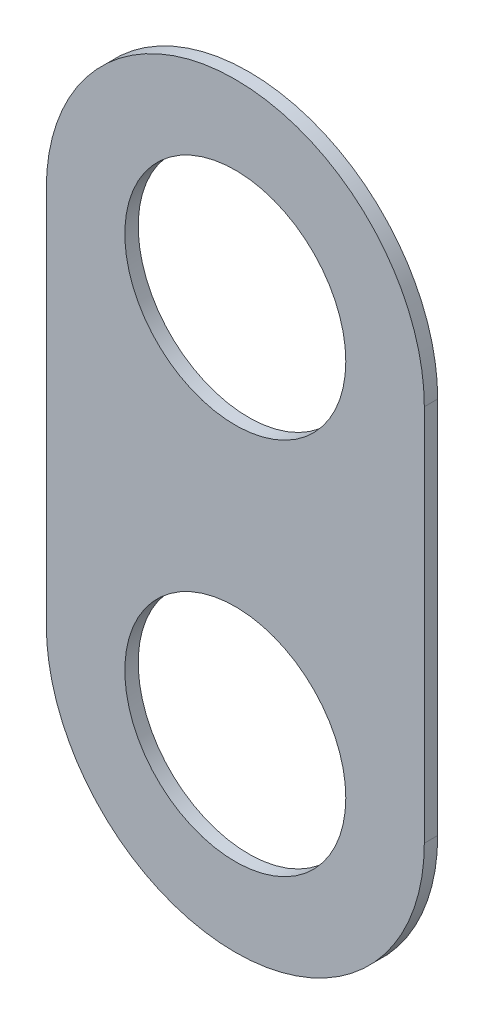
ISO-10303-21;
HEADER;
FILE_DESCRIPTION(('STEP AP214'),'2;1');
FILE_NAME('part.step','',(''),(''),'','','');
FILE_SCHEMA(('AUTOMOTIVE_DESIGN { 1 0 10303 214 1 1 1 1 }'));
ENDSEC;
DATA;
#1=APPLICATION_CONTEXT('core data for automotive mechanical design processes');
#2=APPLICATION_PROTOCOL_DEFINITION('international standard','automotive_design',2000,#1);
#3=PRODUCT_CONTEXT('',#1,'mechanical');
#4=PRODUCT('Part','Part','',(#3));
#5=PRODUCT_RELATED_PRODUCT_CATEGORY('part','',(#4));
#6=PRODUCT_DEFINITION_FORMATION('','',#4);
#7=PRODUCT_DEFINITION_CONTEXT('part definition',#1,'design');
#8=PRODUCT_DEFINITION('design','',#6,#7);
#9=PRODUCT_DEFINITION_SHAPE('','',#8);
#10=(LENGTH_UNIT() NAMED_UNIT(*) SI_UNIT(.MILLI.,.METRE.));
#11=(NAMED_UNIT(*) PLANE_ANGLE_UNIT() SI_UNIT($,.RADIAN.));
#12=(NAMED_UNIT(*) SI_UNIT($,.STERADIAN.) SOLID_ANGLE_UNIT());
#13=UNCERTAINTY_MEASURE_WITH_UNIT(LENGTH_MEASURE(1.E-05),#10,'distance_accuracy_value','');
#14=(GEOMETRIC_REPRESENTATION_CONTEXT(3) GLOBAL_UNCERTAINTY_ASSIGNED_CONTEXT((#13)) GLOBAL_UNIT_ASSIGNED_CONTEXT((#10,
#11,#12)) REPRESENTATION_CONTEXT('',''));
#15=CARTESIAN_POINT('',(0.,0.,0.));
#16=DIRECTION('',(0.,0.,1.));
#17=DIRECTION('',(1.,0.,0.));
#18=AXIS2_PLACEMENT_3D('',#15,#16,#17);
#19=CARTESIAN_POINT('',(19.05,24.7986501429514,1.34885860094992));
#20=DIRECTION('',(0.,0.,1.));
#21=DIRECTION('',(1.,0.,0.));
#22=AXIS2_PLACEMENT_3D('',#19,#20,#21);
#23=PLANE('',#22);
#24=CARTESIAN_POINT('',(19.05,24.7986501429514,1.34885860094992));
#25=DIRECTION('',(0.,0.,1.));
#26=DIRECTION('',(1.,0.,0.));
#27=AXIS2_PLACEMENT_3D('',#24,#25,#26);
#28=CIRCLE('',#27,11.13536);
#29=CARTESIAN_POINT('',(30.18536,24.7986501429514,1.34885860094992));
#30=VERTEX_POINT('',#29);
#31=EDGE_CURVE('E106',#30,#30,#28,.T.);
#32=ORIENTED_EDGE('',*,*,#31,.F.);
#33=EDGE_LOOP('',(#32));
#34=FACE_BOUND('',#33,.T.);
#35=CARTESIAN_POINT('',(19.05,24.7986501429514,1.34885860094992));
#36=DIRECTION('',(0.,0.,1.));
#37=DIRECTION('',(1.,0.,0.));
#38=AXIS2_PLACEMENT_3D('',#35,#36,#37);
#39=CIRCLE('',#38,19.05);
#40=CARTESIAN_POINT('',(38.1,24.7986501429514,1.34885860094992));
#41=VERTEX_POINT('',#40);
#42=CARTESIAN_POINT('',(0.,24.7986501429514,1.34885860094992));
#43=VERTEX_POINT('',#42);
#44=EDGE_CURVE('E91',#41,#43,#39,.T.);
#45=ORIENTED_EDGE('',*,*,#44,.T.);
#46=DIRECTION('',(0.,-1.,0.));
#47=VECTOR('',#46,1.);
#48=CARTESIAN_POINT('',(0.,24.7986501429514,1.34885860094992));
#49=LINE('',#48,#47);
#50=CARTESIAN_POINT('',(0.,-13.3013498570486,1.34885860094992));
#51=VERTEX_POINT('',#50);
#52=EDGE_CURVE('E86',#43,#51,#49,.T.);
#53=ORIENTED_EDGE('',*,*,#52,.T.);
#54=CARTESIAN_POINT('',(19.05,-13.3013498570486,1.34885860094992));
#55=DIRECTION('',(0.,0.,1.));
#56=DIRECTION('',(1.,0.,0.));
#57=AXIS2_PLACEMENT_3D('',#54,#55,#56);
#58=CIRCLE('',#57,19.05);
#59=CARTESIAN_POINT('',(38.1,-13.3013498570486,1.34885860094992));
#60=VERTEX_POINT('',#59);
#61=EDGE_CURVE('E87',#51,#60,#58,.T.);
#62=ORIENTED_EDGE('',*,*,#61,.T.);
#63=DIRECTION('',(0.,1.,0.));
#64=VECTOR('',#63,1.);
#65=CARTESIAN_POINT('',(38.1,24.7986501429514,1.34885860094992));
#66=LINE('',#65,#64);
#67=EDGE_CURVE('E57',#60,#41,#66,.T.);
#68=ORIENTED_EDGE('',*,*,#67,.T.);
#69=EDGE_LOOP('',(#45,#53,#62,#68));
#70=FACE_BOUND('',#69,.T.);
#71=CARTESIAN_POINT('',(19.05,-13.3013498570486,1.34885860094992));
#72=DIRECTION('',(0.,0.,1.));
#73=DIRECTION('',(1.,0.,0.));
#74=AXIS2_PLACEMENT_3D('',#71,#72,#73);
#75=CIRCLE('',#74,11.13536);
#76=CARTESIAN_POINT('',(30.18536,-13.3013498570486,1.34885860094992));
#77=VERTEX_POINT('',#76);
#78=EDGE_CURVE('E123',#77,#77,#75,.T.);
#79=ORIENTED_EDGE('',*,*,#78,.F.);
#80=EDGE_LOOP('',(#79));
#81=FACE_BOUND('',#80,.T.);
#82=ADVANCED_FACE('F39',(#34,#70,#81),#23,.T.);
#83=CARTESIAN_POINT('',(19.05,24.7986501429514,0.));
#84=DIRECTION('',(0.,0.,1.));
#85=DIRECTION('',(1.,0.,0.));
#86=AXIS2_PLACEMENT_3D('',#83,#84,#85);
#87=PLANE('',#86);
#88=CARTESIAN_POINT('',(19.05,24.7986501429514,0.));
#89=DIRECTION('',(0.,0.,1.));
#90=DIRECTION('',(1.,0.,0.));
#91=AXIS2_PLACEMENT_3D('',#88,#89,#90);
#92=CIRCLE('',#91,19.05);
#93=CARTESIAN_POINT('',(38.1,24.7986501429514,0.));
#94=VERTEX_POINT('',#93);
#95=CARTESIAN_POINT('',(0.,24.7986501429514,0.));
#96=VERTEX_POINT('',#95);
#97=EDGE_CURVE('E104',#94,#96,#92,.T.);
#98=ORIENTED_EDGE('',*,*,#97,.F.);
#99=DIRECTION('',(0.,1.,0.));
#100=VECTOR('',#99,1.);
#101=CARTESIAN_POINT('',(38.1,24.7986501429514,0.));
#102=LINE('',#101,#100);
#103=CARTESIAN_POINT('',(38.1,-13.3013498570486,0.));
#104=VERTEX_POINT('',#103);
#105=EDGE_CURVE('E80',#104,#94,#102,.T.);
#106=ORIENTED_EDGE('',*,*,#105,.F.);
#107=CARTESIAN_POINT('',(19.05,-13.3013498570486,0.));
#108=DIRECTION('',(0.,0.,1.));
#109=DIRECTION('',(1.,0.,0.));
#110=AXIS2_PLACEMENT_3D('',#107,#108,#109);
#111=CIRCLE('',#110,19.05);
#112=CARTESIAN_POINT('',(0.,-13.3013498570486,0.));
#113=VERTEX_POINT('',#112);
#114=EDGE_CURVE('E74',#113,#104,#111,.T.);
#115=ORIENTED_EDGE('',*,*,#114,.F.);
#116=DIRECTION('',(0.,-1.,0.));
#117=VECTOR('',#116,1.);
#118=CARTESIAN_POINT('',(0.,24.7986501429514,0.));
#119=LINE('',#118,#117);
#120=EDGE_CURVE('E94',#96,#113,#119,.T.);
#121=ORIENTED_EDGE('',*,*,#120,.F.);
#122=EDGE_LOOP('',(#98,#106,#115,#121));
#123=FACE_BOUND('',#122,.T.);
#124=CARTESIAN_POINT('',(19.05,24.7986501429514,0.));
#125=DIRECTION('',(0.,0.,1.));
#126=DIRECTION('',(1.,0.,0.));
#127=AXIS2_PLACEMENT_3D('',#124,#125,#126);
#128=CIRCLE('',#127,11.13536);
#129=CARTESIAN_POINT('',(30.18536,24.7986501429514,0.));
#130=VERTEX_POINT('',#129);
#131=EDGE_CURVE('E119',#130,#130,#128,.T.);
#132=ORIENTED_EDGE('',*,*,#131,.T.);
#133=EDGE_LOOP('',(#132));
#134=FACE_BOUND('',#133,.T.);
#135=CARTESIAN_POINT('',(19.05,-13.3013498570486,0.));
#136=DIRECTION('',(0.,0.,1.));
#137=DIRECTION('',(1.,0.,0.));
#138=AXIS2_PLACEMENT_3D('',#135,#136,#137);
#139=CIRCLE('',#138,11.13536);
#140=CARTESIAN_POINT('',(30.18536,-13.3013498570486,0.));
#141=VERTEX_POINT('',#140);
#142=EDGE_CURVE('E125',#141,#141,#139,.T.);
#143=ORIENTED_EDGE('',*,*,#142,.T.);
#144=EDGE_LOOP('',(#143));
#145=FACE_BOUND('',#144,.T.);
#146=ADVANCED_FACE('F114',(#123,#134,#145),#87,.F.);
#147=CARTESIAN_POINT('',(19.05,24.7986501429514,1.34885860094992));
#148=DIRECTION('',(0.,0.,-1.));
#149=DIRECTION('',(-1.,0.,0.));
#150=AXIS2_PLACEMENT_3D('',#147,#148,#149);
#151=CYLINDRICAL_SURFACE('',#150,19.05);
#152=ORIENTED_EDGE('',*,*,#97,.T.);
#153=DIRECTION('',(0.,0.,-1.));
#154=VECTOR('',#153,1.);
#155=CARTESIAN_POINT('',(0.,24.7986501429514,1.34885860094992));
#156=LINE('',#155,#154);
#157=EDGE_CURVE('E11',#43,#96,#156,.T.);
#158=ORIENTED_EDGE('',*,*,#157,.F.);
#159=ORIENTED_EDGE('',*,*,#44,.F.);
#160=DIRECTION('',(0.,0.,-1.));
#161=VECTOR('',#160,1.);
#162=CARTESIAN_POINT('',(38.1,24.7986501429514,1.34885860094992));
#163=LINE('',#162,#161);
#164=EDGE_CURVE('E98',#41,#94,#163,.T.);
#165=ORIENTED_EDGE('',*,*,#164,.T.);
#166=EDGE_LOOP('',(#152,#158,#159,#165));
#167=FACE_BOUND('',#166,.T.);
#168=ADVANCED_FACE('F41',(#167),#151,.T.);
#169=CARTESIAN_POINT('',(0.,24.7986501429514,1.34885860094992));
#170=DIRECTION('',(1.,0.,0.));
#171=DIRECTION('',(0.,1.,0.));
#172=AXIS2_PLACEMENT_3D('',#169,#170,#171);
#173=PLANE('',#172);
#174=ORIENTED_EDGE('',*,*,#120,.T.);
#175=DIRECTION('',(0.,0.,-1.));
#176=VECTOR('',#175,1.);
#177=CARTESIAN_POINT('',(0.,-13.3013498570486,1.34885860094992));
#178=LINE('',#177,#176);
#179=EDGE_CURVE('E48',#51,#113,#178,.T.);
#180=ORIENTED_EDGE('',*,*,#179,.F.);
#181=ORIENTED_EDGE('',*,*,#52,.F.);
#182=ORIENTED_EDGE('',*,*,#157,.T.);
#183=EDGE_LOOP('',(#174,#180,#181,#182));
#184=FACE_BOUND('',#183,.T.);
#185=ADVANCED_FACE('F92',(#184),#173,.F.);
#186=CARTESIAN_POINT('',(19.05,-13.3013498570486,1.34885860094992));
#187=DIRECTION('',(0.,0.,-1.));
#188=DIRECTION('',(-1.,0.,0.));
#189=AXIS2_PLACEMENT_3D('',#186,#187,#188);
#190=CYLINDRICAL_SURFACE('',#189,19.05);
#191=ORIENTED_EDGE('',*,*,#114,.T.);
#192=DIRECTION('',(0.,0.,-1.));
#193=VECTOR('',#192,1.);
#194=CARTESIAN_POINT('',(38.1,-13.3013498570486,1.34885860094992));
#195=LINE('',#194,#193);
#196=EDGE_CURVE('E96',#60,#104,#195,.T.);
#197=ORIENTED_EDGE('',*,*,#196,.F.);
#198=ORIENTED_EDGE('',*,*,#61,.F.);
#199=ORIENTED_EDGE('',*,*,#179,.T.);
#200=EDGE_LOOP('',(#191,#197,#198,#199));
#201=FACE_BOUND('',#200,.T.);
#202=ADVANCED_FACE('F100',(#201),#190,.T.);
#203=CARTESIAN_POINT('',(38.1,24.7986501429514,1.34885860094992));
#204=DIRECTION('',(-1.,0.,0.));
#205=DIRECTION('',(0.,0.,1.));
#206=AXIS2_PLACEMENT_3D('',#203,#204,#205);
#207=PLANE('',#206);
#208=ORIENTED_EDGE('',*,*,#105,.T.);
#209=ORIENTED_EDGE('',*,*,#164,.F.);
#210=ORIENTED_EDGE('',*,*,#67,.F.);
#211=ORIENTED_EDGE('',*,*,#196,.T.);
#212=EDGE_LOOP('',(#208,#209,#210,#211));
#213=FACE_BOUND('',#212,.T.);
#214=ADVANCED_FACE('F112',(#213),#207,.F.);
#215=CARTESIAN_POINT('',(19.05,24.7986501429514,1.34885860094992));
#216=DIRECTION('',(0.,0.,-1.));
#217=DIRECTION('',(-1.,0.,0.));
#218=AXIS2_PLACEMENT_3D('',#215,#216,#217);
#219=CYLINDRICAL_SURFACE('',#218,11.13536);
#220=ORIENTED_EDGE('',*,*,#31,.T.);
#221=EDGE_LOOP('',(#220));
#222=FACE_BOUND('',#221,.T.);
#223=ORIENTED_EDGE('',*,*,#131,.F.);
#224=EDGE_LOOP('',(#223));
#225=FACE_BOUND('',#224,.T.);
#226=ADVANCED_FACE('F141',(#222,#225),#219,.F.);
#227=CARTESIAN_POINT('',(19.05,-13.3013498570486,1.34885860094992));
#228=DIRECTION('',(0.,0.,-1.));
#229=DIRECTION('',(-1.,0.,0.));
#230=AXIS2_PLACEMENT_3D('',#227,#228,#229);
#231=CYLINDRICAL_SURFACE('',#230,11.13536);
#232=ORIENTED_EDGE('',*,*,#78,.T.);
#233=EDGE_LOOP('',(#232));
#234=FACE_BOUND('',#233,.T.);
#235=ORIENTED_EDGE('',*,*,#142,.F.);
#236=EDGE_LOOP('',(#235));
#237=FACE_BOUND('',#236,.T.);
#238=ADVANCED_FACE('F127',(#234,#237),#231,.F.);
#239=CLOSED_SHELL('',(#82,#146,#168,#185,#202,#214,#226,#238));
#240=MANIFOLD_SOLID_BREP('B2',#239);
#241=ADVANCED_BREP_SHAPE_REPRESENTATION('',(#18,#240),#14);
#242=SHAPE_DEFINITION_REPRESENTATION(#9,#241);
ENDSEC;
END-ISO-10303-21;
